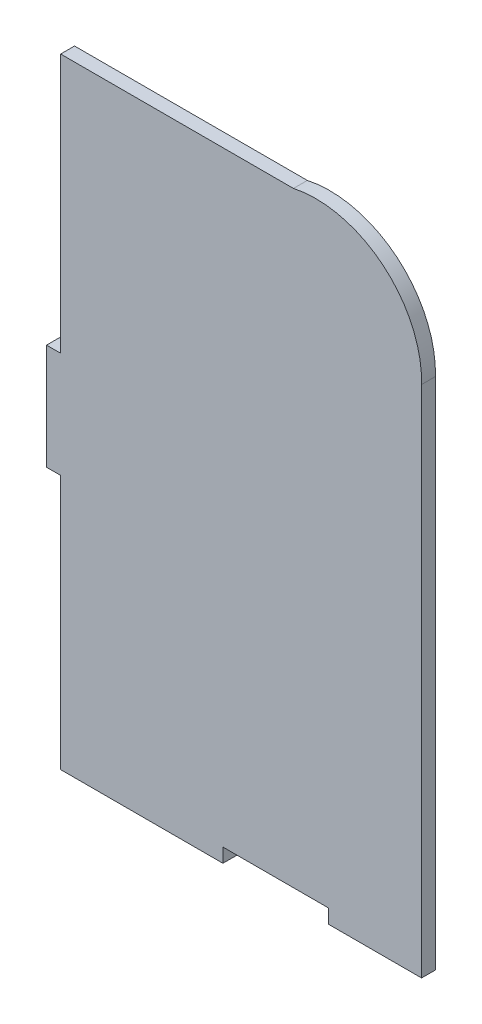
ISO-10303-21;
HEADER;
FILE_DESCRIPTION(('STEP AP214'),'2;1');
FILE_NAME('part.step','',(''),(''),'','','');
FILE_SCHEMA(('AUTOMOTIVE_DESIGN { 1 0 10303 214 1 1 1 1 }'));
ENDSEC;
DATA;
#1=APPLICATION_CONTEXT('core data for automotive mechanical design processes');
#2=APPLICATION_PROTOCOL_DEFINITION('international standard','automotive_design',2000,#1);
#3=PRODUCT_CONTEXT('',#1,'mechanical');
#4=PRODUCT('Part','Part','',(#3));
#5=PRODUCT_RELATED_PRODUCT_CATEGORY('part','',(#4));
#6=PRODUCT_DEFINITION_FORMATION('','',#4);
#7=PRODUCT_DEFINITION_CONTEXT('part definition',#1,'design');
#8=PRODUCT_DEFINITION('design','',#6,#7);
#9=PRODUCT_DEFINITION_SHAPE('','',#8);
#10=(LENGTH_UNIT() NAMED_UNIT(*) SI_UNIT(.MILLI.,.METRE.));
#11=(NAMED_UNIT(*) PLANE_ANGLE_UNIT() SI_UNIT($,.RADIAN.));
#12=(NAMED_UNIT(*) SI_UNIT($,.STERADIAN.) SOLID_ANGLE_UNIT());
#13=UNCERTAINTY_MEASURE_WITH_UNIT(LENGTH_MEASURE(1.E-05),#10,'distance_accuracy_value','');
#14=(GEOMETRIC_REPRESENTATION_CONTEXT(3) GLOBAL_UNCERTAINTY_ASSIGNED_CONTEXT((#13)) GLOBAL_UNIT_ASSIGNED_CONTEXT((#10,
#11,#12)) REPRESENTATION_CONTEXT('',''));
#15=CARTESIAN_POINT('',(0.,0.,0.));
#16=DIRECTION('',(0.,0.,1.));
#17=DIRECTION('',(1.,0.,0.));
#18=AXIS2_PLACEMENT_3D('',#15,#16,#17);
#19=CARTESIAN_POINT('',(215.836077163594,-23.4700000000001,-10.));
#20=DIRECTION('',(-1.,0.,0.));
#21=DIRECTION('',(0.,-1.,0.));
#22=AXIS2_PLACEMENT_3D('',#19,#20,#21);
#23=PLANE('',#22);
#24=DIRECTION('',(0.,-1.,0.));
#25=VECTOR('',#24,1.);
#26=CARTESIAN_POINT('',(215.836077163594,-23.4700000000001,0.));
#27=LINE('',#26,#25);
#28=CARTESIAN_POINT('',(215.836077163594,-23.4700000000001,0.));
#29=VERTEX_POINT('',#28);
#30=CARTESIAN_POINT('',(215.836077163594,-210.16,0.));
#31=VERTEX_POINT('',#30);
#32=EDGE_CURVE('E166',#29,#31,#27,.T.);
#33=ORIENTED_EDGE('',*,*,#32,.F.);
#34=DIRECTION('',(0.,0.,1.));
#35=VECTOR('',#34,1.);
#36=CARTESIAN_POINT('',(215.836077163594,-23.4700000000001,-10.));
#37=LINE('',#36,#35);
#38=CARTESIAN_POINT('',(215.836077163594,-23.4700000000001,-10.));
#39=VERTEX_POINT('',#38);
#40=EDGE_CURVE('E11',#39,#29,#37,.T.);
#41=ORIENTED_EDGE('',*,*,#40,.F.);
#42=DIRECTION('',(0.,-1.,0.));
#43=VECTOR('',#42,1.);
#44=CARTESIAN_POINT('',(215.836077163594,-23.4700000000001,-10.));
#45=LINE('',#44,#43);
#46=CARTESIAN_POINT('',(215.836077163594,-210.16,-10.));
#47=VERTEX_POINT('',#46);
#48=EDGE_CURVE('E201',#39,#47,#45,.T.);
#49=ORIENTED_EDGE('',*,*,#48,.T.);
#50=DIRECTION('',(0.,0.,1.));
#51=VECTOR('',#50,1.);
#52=CARTESIAN_POINT('',(215.836077163594,-210.16,-10.));
#53=LINE('',#52,#51);
#54=EDGE_CURVE('E42',#47,#31,#53,.T.);
#55=ORIENTED_EDGE('',*,*,#54,.T.);
#56=EDGE_LOOP('',(#33,#41,#49,#55));
#57=FACE_BOUND('',#56,.T.);
#58=ADVANCED_FACE('F39',(#57),#23,.T.);
#59=CARTESIAN_POINT('',(215.836077163594,-23.4700000000001,-10.));
#60=DIRECTION('',(0.,1.,0.));
#61=DIRECTION('',(0.,0.,1.));
#62=AXIS2_PLACEMENT_3D('',#59,#60,#61);
#63=PLANE('',#62);
#64=DIRECTION('',(-1.,0.,0.));
#65=VECTOR('',#64,1.);
#66=CARTESIAN_POINT('',(215.836077163594,-23.4700000000001,0.));
#67=LINE('',#66,#65);
#68=CARTESIAN_POINT('',(383.528279605789,-23.4700000000001,0.));
#69=VERTEX_POINT('',#68);
#70=EDGE_CURVE('E199',#69,#29,#67,.T.);
#71=ORIENTED_EDGE('',*,*,#70,.F.);
#72=DIRECTION('',(0.,0.,1.));
#73=VECTOR('',#72,1.);
#74=CARTESIAN_POINT('',(383.528279605789,-23.4700000000001,-10.));
#75=LINE('',#74,#73);
#76=CARTESIAN_POINT('',(383.528279605789,-23.4700000000001,-10.));
#77=VERTEX_POINT('',#76);
#78=EDGE_CURVE('E48',#77,#69,#75,.T.);
#79=ORIENTED_EDGE('',*,*,#78,.F.);
#80=DIRECTION('',(-1.,0.,0.));
#81=VECTOR('',#80,1.);
#82=CARTESIAN_POINT('',(215.836077163594,-23.4700000000001,-10.));
#83=LINE('',#82,#81);
#84=EDGE_CURVE('E156',#77,#39,#83,.T.);
#85=ORIENTED_EDGE('',*,*,#84,.T.);
#86=ORIENTED_EDGE('',*,*,#40,.T.);
#87=EDGE_LOOP('',(#71,#79,#85,#86));
#88=FACE_BOUND('',#87,.T.);
#89=ADVANCED_FACE('F223',(#88),#63,.T.);
#90=CARTESIAN_POINT('',(399.649109312264,-97.9452230582418,-10.));
#91=DIRECTION('',(0.,0.,1.));
#92=DIRECTION('',(1.,0.,0.));
#93=AXIS2_PLACEMENT_3D('',#90,#91,#92);
#94=CYLINDRICAL_SURFACE('',#93,76.2);
#95=CARTESIAN_POINT('',(399.649109312264,-97.9452230582418,0.));
#96=DIRECTION('',(0.,0.,1.));
#97=DIRECTION('',(1.,0.,0.));
#98=AXIS2_PLACEMENT_3D('',#95,#96,#97);
#99=CIRCLE('',#98,76.2);
#100=CARTESIAN_POINT('',(475.829586762206,-99.6700000000004,0.));
#101=VERTEX_POINT('',#100);
#102=EDGE_CURVE('E143',#101,#69,#99,.T.);
#103=ORIENTED_EDGE('',*,*,#102,.F.);
#104=DIRECTION('',(0.,0.,1.));
#105=VECTOR('',#104,1.);
#106=CARTESIAN_POINT('',(475.829586762206,-99.6700000000004,-10.));
#107=LINE('',#106,#105);
#108=CARTESIAN_POINT('',(475.829586762206,-99.6700000000004,-10.));
#109=VERTEX_POINT('',#108);
#110=EDGE_CURVE('E138',#109,#101,#107,.T.);
#111=ORIENTED_EDGE('',*,*,#110,.F.);
#112=CARTESIAN_POINT('',(399.649109312264,-97.9452230582418,-10.));
#113=DIRECTION('',(0.,0.,1.));
#114=DIRECTION('',(1.,0.,0.));
#115=AXIS2_PLACEMENT_3D('',#112,#113,#114);
#116=CIRCLE('',#115,76.2);
#117=EDGE_CURVE('E141',#109,#77,#116,.T.);
#118=ORIENTED_EDGE('',*,*,#117,.T.);
#119=ORIENTED_EDGE('',*,*,#78,.T.);
#120=EDGE_LOOP('',(#103,#111,#118,#119));
#121=FACE_BOUND('',#120,.T.);
#122=ADVANCED_FACE('F140',(#121),#94,.T.);
#123=CARTESIAN_POINT('',(475.829586762206,-99.6700000000004,-10.));
#124=DIRECTION('',(1.,0.,0.));
#125=DIRECTION('',(0.,1.,0.));
#126=AXIS2_PLACEMENT_3D('',#123,#124,#125);
#127=PLANE('',#126);
#128=DIRECTION('',(0.,1.,0.));
#129=VECTOR('',#128,1.);
#130=CARTESIAN_POINT('',(475.829586762206,-99.6700000000004,0.));
#131=LINE('',#130,#129);
#132=CARTESIAN_POINT('',(475.829586762206,-469.9,0.));
#133=VERTEX_POINT('',#132);
#134=EDGE_CURVE('E196',#133,#101,#131,.T.);
#135=ORIENTED_EDGE('',*,*,#134,.F.);
#136=DIRECTION('',(0.,0.,1.));
#137=VECTOR('',#136,1.);
#138=CARTESIAN_POINT('',(475.829586762206,-469.9,-10.));
#139=LINE('',#138,#137);
#140=CARTESIAN_POINT('',(475.829586762206,-469.9,-10.));
#141=VERTEX_POINT('',#140);
#142=EDGE_CURVE('E148',#141,#133,#139,.T.);
#143=ORIENTED_EDGE('',*,*,#142,.F.);
#144=DIRECTION('',(0.,1.,0.));
#145=VECTOR('',#144,1.);
#146=CARTESIAN_POINT('',(475.829586762206,-99.6700000000004,-10.));
#147=LINE('',#146,#145);
#148=EDGE_CURVE('E154',#141,#109,#147,.T.);
#149=ORIENTED_EDGE('',*,*,#148,.T.);
#150=ORIENTED_EDGE('',*,*,#110,.T.);
#151=EDGE_LOOP('',(#135,#143,#149,#150));
#152=FACE_BOUND('',#151,.T.);
#153=ADVANCED_FACE('F158',(#152),#127,.T.);
#154=CARTESIAN_POINT('',(408.9217892044,-469.9,-10.));
#155=DIRECTION('',(0.,-1.,0.));
#156=DIRECTION('',(0.,0.,-1.));
#157=AXIS2_PLACEMENT_3D('',#154,#155,#156);
#158=PLANE('',#157);
#159=DIRECTION('',(1.,0.,0.));
#160=VECTOR('',#159,1.);
#161=CARTESIAN_POINT('',(408.9217892044,-469.9,0.));
#162=LINE('',#161,#160);
#163=CARTESIAN_POINT('',(408.9217892044,-469.9,0.));
#164=VERTEX_POINT('',#163);
#165=EDGE_CURVE('E193',#164,#133,#162,.T.);
#166=ORIENTED_EDGE('',*,*,#165,.F.);
#167=DIRECTION('',(0.,0.,1.));
#168=VECTOR('',#167,1.);
#169=CARTESIAN_POINT('',(408.9217892044,-469.9,-10.));
#170=LINE('',#169,#168);
#171=CARTESIAN_POINT('',(408.9217892044,-469.9,-10.));
#172=VERTEX_POINT('',#171);
#173=EDGE_CURVE('E205',#172,#164,#170,.T.);
#174=ORIENTED_EDGE('',*,*,#173,.F.);
#175=DIRECTION('',(1.,0.,0.));
#176=VECTOR('',#175,1.);
#177=CARTESIAN_POINT('',(408.9217892044,-469.9,-10.));
#178=LINE('',#177,#176);
#179=EDGE_CURVE('E159',#172,#141,#178,.T.);
#180=ORIENTED_EDGE('',*,*,#179,.T.);
#181=ORIENTED_EDGE('',*,*,#142,.T.);
#182=EDGE_LOOP('',(#166,#174,#180,#181));
#183=FACE_BOUND('',#182,.T.);
#184=ADVANCED_FACE('F236',(#183),#158,.T.);
#185=CARTESIAN_POINT('',(408.9217892044,-469.9,-10.));
#186=DIRECTION('',(-1.,0.,0.));
#187=DIRECTION('',(0.,0.,1.));
#188=AXIS2_PLACEMENT_3D('',#185,#186,#187);
#189=PLANE('',#188);
#190=DIRECTION('',(0.,-1.,0.));
#191=VECTOR('',#190,1.);
#192=CARTESIAN_POINT('',(408.9217892044,-469.9,0.));
#193=LINE('',#192,#191);
#194=CARTESIAN_POINT('',(408.9217892044,-459.739999999998,0.));
#195=VERTEX_POINT('',#194);
#196=EDGE_CURVE('E190',#195,#164,#193,.T.);
#197=ORIENTED_EDGE('',*,*,#196,.F.);
#198=DIRECTION('',(0.,0.,1.));
#199=VECTOR('',#198,1.);
#200=CARTESIAN_POINT('',(408.9217892044,-459.739999999998,-10.));
#201=LINE('',#200,#199);
#202=CARTESIAN_POINT('',(408.9217892044,-459.739999999998,-10.));
#203=VERTEX_POINT('',#202);
#204=EDGE_CURVE('E207',#203,#195,#201,.T.);
#205=ORIENTED_EDGE('',*,*,#204,.F.);
#206=DIRECTION('',(0.,-1.,0.));
#207=VECTOR('',#206,1.);
#208=CARTESIAN_POINT('',(408.9217892044,-469.9,-10.));
#209=LINE('',#208,#207);
#210=EDGE_CURVE('E161',#203,#172,#209,.T.);
#211=ORIENTED_EDGE('',*,*,#210,.T.);
#212=ORIENTED_EDGE('',*,*,#173,.T.);
#213=EDGE_LOOP('',(#197,#205,#211,#212));
#214=FACE_BOUND('',#213,.T.);
#215=ADVANCED_FACE('F239',(#214),#189,.T.);
#216=CARTESIAN_POINT('',(408.9217892044,-459.739999999998,-10.));
#217=DIRECTION('',(0.,-1.,0.));
#218=DIRECTION('',(0.,0.,-1.));
#219=AXIS2_PLACEMENT_3D('',#216,#217,#218);
#220=PLANE('',#219);
#221=DIRECTION('',(1.,0.,0.));
#222=VECTOR('',#221,1.);
#223=CARTESIAN_POINT('',(408.9217892044,-459.739999999998,0.));
#224=LINE('',#223,#222);
#225=CARTESIAN_POINT('',(332.7217892044,-459.739999999998,0.));
#226=VERTEX_POINT('',#225);
#227=EDGE_CURVE('E187',#226,#195,#224,.T.);
#228=ORIENTED_EDGE('',*,*,#227,.F.);
#229=DIRECTION('',(0.,0.,1.));
#230=VECTOR('',#229,1.);
#231=CARTESIAN_POINT('',(332.7217892044,-459.739999999998,-10.));
#232=LINE('',#231,#230);
#233=CARTESIAN_POINT('',(332.7217892044,-459.739999999998,-10.));
#234=VERTEX_POINT('',#233);
#235=EDGE_CURVE('E209',#234,#226,#232,.T.);
#236=ORIENTED_EDGE('',*,*,#235,.F.);
#237=DIRECTION('',(1.,0.,0.));
#238=VECTOR('',#237,1.);
#239=CARTESIAN_POINT('',(408.9217892044,-459.739999999998,-10.));
#240=LINE('',#239,#238);
#241=EDGE_CURVE('E411',#234,#203,#240,.T.);
#242=ORIENTED_EDGE('',*,*,#241,.T.);
#243=ORIENTED_EDGE('',*,*,#204,.T.);
#244=EDGE_LOOP('',(#228,#236,#242,#243));
#245=FACE_BOUND('',#244,.T.);
#246=ADVANCED_FACE('F243',(#245),#220,.T.);
#247=CARTESIAN_POINT('',(332.7217892044,-459.739999999998,-10.));
#248=DIRECTION('',(1.,0.,0.));
#249=DIRECTION('',(0.,0.,-1.));
#250=AXIS2_PLACEMENT_3D('',#247,#248,#249);
#251=PLANE('',#250);
#252=DIRECTION('',(0.,1.,0.));
#253=VECTOR('',#252,1.);
#254=CARTESIAN_POINT('',(332.7217892044,-459.739999999998,0.));
#255=LINE('',#254,#253);
#256=CARTESIAN_POINT('',(332.7217892044,-469.9,0.));
#257=VERTEX_POINT('',#256);
#258=EDGE_CURVE('E184',#257,#226,#255,.T.);
#259=ORIENTED_EDGE('',*,*,#258,.F.);
#260=DIRECTION('',(0.,0.,1.));
#261=VECTOR('',#260,1.);
#262=CARTESIAN_POINT('',(332.7217892044,-469.9,-10.));
#263=LINE('',#262,#261);
#264=CARTESIAN_POINT('',(332.7217892044,-469.9,-10.));
#265=VERTEX_POINT('',#264);
#266=EDGE_CURVE('E211',#265,#257,#263,.T.);
#267=ORIENTED_EDGE('',*,*,#266,.F.);
#268=DIRECTION('',(0.,1.,0.));
#269=VECTOR('',#268,1.);
#270=CARTESIAN_POINT('',(332.7217892044,-459.739999999998,-10.));
#271=LINE('',#270,#269);
#272=EDGE_CURVE('E407',#265,#234,#271,.T.);
#273=ORIENTED_EDGE('',*,*,#272,.T.);
#274=ORIENTED_EDGE('',*,*,#235,.T.);
#275=EDGE_LOOP('',(#259,#267,#273,#274));
#276=FACE_BOUND('',#275,.T.);
#277=ADVANCED_FACE('F247',(#276),#251,.T.);
#278=CARTESIAN_POINT('',(215.829586762206,-469.9,-10.));
#279=DIRECTION('',(0.,-1.,0.));
#280=DIRECTION('',(0.,0.,-1.));
#281=AXIS2_PLACEMENT_3D('',#278,#279,#280);
#282=PLANE('',#281);
#283=DIRECTION('',(1.,0.,0.));
#284=VECTOR('',#283,1.);
#285=CARTESIAN_POINT('',(215.829586762206,-469.9,0.));
#286=LINE('',#285,#284);
#287=CARTESIAN_POINT('',(215.829586762206,-469.9,0.));
#288=VERTEX_POINT('',#287);
#289=EDGE_CURVE('E181',#288,#257,#286,.T.);
#290=ORIENTED_EDGE('',*,*,#289,.F.);
#291=DIRECTION('',(0.,0.,1.));
#292=VECTOR('',#291,1.);
#293=CARTESIAN_POINT('',(215.829586762206,-469.9,-10.));
#294=LINE('',#293,#292);
#295=CARTESIAN_POINT('',(215.829586762206,-469.9,-10.));
#296=VERTEX_POINT('',#295);
#297=EDGE_CURVE('E213',#296,#288,#294,.T.);
#298=ORIENTED_EDGE('',*,*,#297,.F.);
#299=DIRECTION('',(1.,0.,0.));
#300=VECTOR('',#299,1.);
#301=CARTESIAN_POINT('',(215.829586762206,-469.9,-10.));
#302=LINE('',#301,#300);
#303=EDGE_CURVE('E418',#296,#265,#302,.T.);
#304=ORIENTED_EDGE('',*,*,#303,.T.);
#305=ORIENTED_EDGE('',*,*,#266,.T.);
#306=EDGE_LOOP('',(#290,#298,#304,#305));
#307=FACE_BOUND('',#306,.T.);
#308=ADVANCED_FACE('F251',(#307),#282,.T.);
#309=CARTESIAN_POINT('',(215.829586762206,-286.36,-10.));
#310=DIRECTION('',(-1.,0.,0.));
#311=DIRECTION('',(0.,-1.,0.));
#312=AXIS2_PLACEMENT_3D('',#309,#310,#311);
#313=PLANE('',#312);
#314=DIRECTION('',(0.,-1.,0.));
#315=VECTOR('',#314,1.);
#316=CARTESIAN_POINT('',(215.829586762206,-286.36,0.));
#317=LINE('',#316,#315);
#318=CARTESIAN_POINT('',(215.829586762206,-286.36,0.));
#319=VERTEX_POINT('',#318);
#320=EDGE_CURVE('E178',#319,#288,#317,.T.);
#321=ORIENTED_EDGE('',*,*,#320,.F.);
#322=DIRECTION('',(0.,0.,1.));
#323=VECTOR('',#322,1.);
#324=CARTESIAN_POINT('',(215.829586762206,-286.36,-10.));
#325=LINE('',#324,#323);
#326=CARTESIAN_POINT('',(215.829586762206,-286.36,-10.));
#327=VERTEX_POINT('',#326);
#328=EDGE_CURVE('E215',#327,#319,#325,.T.);
#329=ORIENTED_EDGE('',*,*,#328,.F.);
#330=DIRECTION('',(0.,-1.,0.));
#331=VECTOR('',#330,1.);
#332=CARTESIAN_POINT('',(215.829586762206,-286.36,-10.));
#333=LINE('',#332,#331);
#334=EDGE_CURVE('E400',#327,#296,#333,.T.);
#335=ORIENTED_EDGE('',*,*,#334,.T.);
#336=ORIENTED_EDGE('',*,*,#297,.T.);
#337=EDGE_LOOP('',(#321,#329,#335,#336));
#338=FACE_BOUND('',#337,.T.);
#339=ADVANCED_FACE('F255',(#338),#313,.T.);
#340=CARTESIAN_POINT('',(205.669586762206,-286.36,-10.));
#341=DIRECTION('',(0.,-1.,0.));
#342=DIRECTION('',(1.,0.,0.));
#343=AXIS2_PLACEMENT_3D('',#340,#341,#342);
#344=PLANE('',#343);
#345=DIRECTION('',(1.,0.,0.));
#346=VECTOR('',#345,1.);
#347=CARTESIAN_POINT('',(205.669586762206,-286.36,0.));
#348=LINE('',#347,#346);
#349=CARTESIAN_POINT('',(205.669586762206,-286.36,0.));
#350=VERTEX_POINT('',#349);
#351=EDGE_CURVE('E175',#350,#319,#348,.T.);
#352=ORIENTED_EDGE('',*,*,#351,.F.);
#353=DIRECTION('',(0.,0.,1.));
#354=VECTOR('',#353,1.);
#355=CARTESIAN_POINT('',(205.669586762206,-286.36,-10.));
#356=LINE('',#355,#354);
#357=CARTESIAN_POINT('',(205.669586762206,-286.36,-10.));
#358=VERTEX_POINT('',#357);
#359=EDGE_CURVE('E217',#358,#350,#356,.T.);
#360=ORIENTED_EDGE('',*,*,#359,.F.);
#361=DIRECTION('',(1.,0.,0.));
#362=VECTOR('',#361,1.);
#363=CARTESIAN_POINT('',(205.669586762206,-286.36,-10.));
#364=LINE('',#363,#362);
#365=EDGE_CURVE('E396',#358,#327,#364,.T.);
#366=ORIENTED_EDGE('',*,*,#365,.T.);
#367=ORIENTED_EDGE('',*,*,#328,.T.);
#368=EDGE_LOOP('',(#352,#360,#366,#367));
#369=FACE_BOUND('',#368,.T.);
#370=ADVANCED_FACE('F259',(#369),#344,.T.);
#371=CARTESIAN_POINT('',(205.669586762206,-210.16,-10.));
#372=DIRECTION('',(-1.,0.,0.));
#373=DIRECTION('',(0.,-1.,0.));
#374=AXIS2_PLACEMENT_3D('',#371,#372,#373);
#375=PLANE('',#374);
#376=DIRECTION('',(0.,-1.,0.));
#377=VECTOR('',#376,1.);
#378=CARTESIAN_POINT('',(205.669586762206,-210.16,0.));
#379=LINE('',#378,#377);
#380=CARTESIAN_POINT('',(205.669586762206,-210.16,0.));
#381=VERTEX_POINT('',#380);
#382=EDGE_CURVE('E172',#381,#350,#379,.T.);
#383=ORIENTED_EDGE('',*,*,#382,.F.);
#384=DIRECTION('',(0.,0.,1.));
#385=VECTOR('',#384,1.);
#386=CARTESIAN_POINT('',(205.669586762206,-210.16,-10.));
#387=LINE('',#386,#385);
#388=CARTESIAN_POINT('',(205.669586762206,-210.16,-10.));
#389=VERTEX_POINT('',#388);
#390=EDGE_CURVE('E218',#389,#381,#387,.T.);
#391=ORIENTED_EDGE('',*,*,#390,.F.);
#392=DIRECTION('',(0.,-1.,0.));
#393=VECTOR('',#392,1.);
#394=CARTESIAN_POINT('',(205.669586762206,-210.16,-10.));
#395=LINE('',#394,#393);
#396=EDGE_CURVE('E422',#389,#358,#395,.T.);
#397=ORIENTED_EDGE('',*,*,#396,.T.);
#398=ORIENTED_EDGE('',*,*,#359,.T.);
#399=EDGE_LOOP('',(#383,#391,#397,#398));
#400=FACE_BOUND('',#399,.T.);
#401=ADVANCED_FACE('F263',(#400),#375,.T.);
#402=CARTESIAN_POINT('',(215.836077163594,-210.16,-10.));
#403=DIRECTION('',(0.,1.,0.));
#404=DIRECTION('',(-1.,0.,0.));
#405=AXIS2_PLACEMENT_3D('',#402,#403,#404);
#406=PLANE('',#405);
#407=DIRECTION('',(-1.,0.,0.));
#408=VECTOR('',#407,1.);
#409=CARTESIAN_POINT('',(215.836077163594,-210.16,0.));
#410=LINE('',#409,#408);
#411=EDGE_CURVE('E169',#31,#381,#410,.T.);
#412=ORIENTED_EDGE('',*,*,#411,.F.);
#413=ORIENTED_EDGE('',*,*,#54,.F.);
#414=DIRECTION('',(-1.,0.,0.));
#415=VECTOR('',#414,1.);
#416=CARTESIAN_POINT('',(215.836077163594,-210.16,-10.));
#417=LINE('',#416,#415);
#418=EDGE_CURVE('E424',#47,#389,#417,.T.);
#419=ORIENTED_EDGE('',*,*,#418,.T.);
#420=ORIENTED_EDGE('',*,*,#390,.T.);
#421=EDGE_LOOP('',(#412,#413,#419,#420));
#422=FACE_BOUND('',#421,.T.);
#423=ADVANCED_FACE('F220',(#422),#406,.T.);
#424=CARTESIAN_POINT('',(399.649109312264,-97.9452230582418,-10.));
#425=DIRECTION('',(0.,0.,1.));
#426=DIRECTION('',(1.,0.,0.));
#427=AXIS2_PLACEMENT_3D('',#424,#425,#426);
#428=PLANE('',#427);
#429=ORIENTED_EDGE('',*,*,#48,.F.);
#430=ORIENTED_EDGE('',*,*,#84,.F.);
#431=ORIENTED_EDGE('',*,*,#117,.F.);
#432=ORIENTED_EDGE('',*,*,#148,.F.);
#433=ORIENTED_EDGE('',*,*,#179,.F.);
#434=ORIENTED_EDGE('',*,*,#210,.F.);
#435=ORIENTED_EDGE('',*,*,#241,.F.);
#436=ORIENTED_EDGE('',*,*,#272,.F.);
#437=ORIENTED_EDGE('',*,*,#303,.F.);
#438=ORIENTED_EDGE('',*,*,#334,.F.);
#439=ORIENTED_EDGE('',*,*,#365,.F.);
#440=ORIENTED_EDGE('',*,*,#396,.F.);
#441=ORIENTED_EDGE('',*,*,#418,.F.);
#442=EDGE_LOOP('',(#429,#430,#431,#432,#433,#434,#435,#436,#437,#438,#439,#440,#441));
#443=FACE_BOUND('',#442,.T.);
#444=ADVANCED_FACE('F152',(#443),#428,.F.);
#445=CARTESIAN_POINT('',(399.649109312264,-97.9452230582418,0.));
#446=DIRECTION('',(0.,0.,1.));
#447=DIRECTION('',(1.,0.,0.));
#448=AXIS2_PLACEMENT_3D('',#445,#446,#447);
#449=PLANE('',#448);
#450=ORIENTED_EDGE('',*,*,#32,.T.);
#451=ORIENTED_EDGE('',*,*,#411,.T.);
#452=ORIENTED_EDGE('',*,*,#382,.T.);
#453=ORIENTED_EDGE('',*,*,#351,.T.);
#454=ORIENTED_EDGE('',*,*,#320,.T.);
#455=ORIENTED_EDGE('',*,*,#289,.T.);
#456=ORIENTED_EDGE('',*,*,#258,.T.);
#457=ORIENTED_EDGE('',*,*,#227,.T.);
#458=ORIENTED_EDGE('',*,*,#196,.T.);
#459=ORIENTED_EDGE('',*,*,#165,.T.);
#460=ORIENTED_EDGE('',*,*,#134,.T.);
#461=ORIENTED_EDGE('',*,*,#102,.T.);
#462=ORIENTED_EDGE('',*,*,#70,.T.);
#463=EDGE_LOOP('',(#450,#451,#452,#453,#454,#455,#456,#457,#458,#459,#460,#461,#462));
#464=FACE_BOUND('',#463,.T.);
#465=ADVANCED_FACE('F222',(#464),#449,.T.);
#466=CLOSED_SHELL('',(#58,#89,#122,#153,#184,#215,#246,#277,#308,#339,#370,#401,#423,#444,#465));
#467=MANIFOLD_SOLID_BREP('B2',#466);
#468=ADVANCED_BREP_SHAPE_REPRESENTATION('',(#18,#467),#14);
#469=SHAPE_DEFINITION_REPRESENTATION(#9,#468);
ENDSEC;
END-ISO-10303-21;
